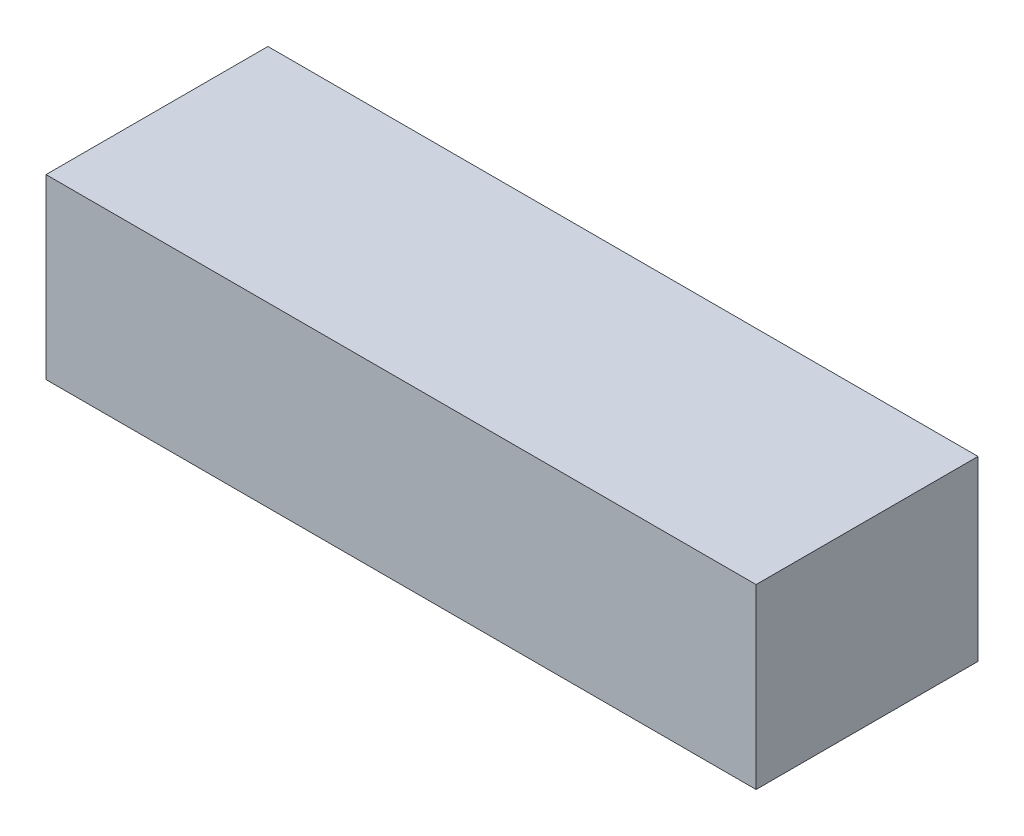
ISO-10303-21;
HEADER;
FILE_DESCRIPTION(('STEP AP214'),'2;1');
FILE_NAME('part.step','',(''),(''),'','','');
FILE_SCHEMA(('AUTOMOTIVE_DESIGN { 1 0 10303 214 1 1 1 1 }'));
ENDSEC;
DATA;
#1=APPLICATION_CONTEXT('core data for automotive mechanical design processes');
#2=APPLICATION_PROTOCOL_DEFINITION('international standard','automotive_design',2000,#1);
#3=PRODUCT_CONTEXT('',#1,'mechanical');
#4=PRODUCT('Part','Part','',(#3));
#5=PRODUCT_RELATED_PRODUCT_CATEGORY('part','',(#4));
#6=PRODUCT_DEFINITION_FORMATION('','',#4);
#7=PRODUCT_DEFINITION_CONTEXT('part definition',#1,'design');
#8=PRODUCT_DEFINITION('design','',#6,#7);
#9=PRODUCT_DEFINITION_SHAPE('','',#8);
#10=(LENGTH_UNIT() NAMED_UNIT(*) SI_UNIT(.MILLI.,.METRE.));
#11=(NAMED_UNIT(*) PLANE_ANGLE_UNIT() SI_UNIT($,.RADIAN.));
#12=(NAMED_UNIT(*) SI_UNIT($,.STERADIAN.) SOLID_ANGLE_UNIT());
#13=UNCERTAINTY_MEASURE_WITH_UNIT(LENGTH_MEASURE(1.E-05),#10,'distance_accuracy_value','');
#14=(GEOMETRIC_REPRESENTATION_CONTEXT(3) GLOBAL_UNCERTAINTY_ASSIGNED_CONTEXT((#13)) GLOBAL_UNIT_ASSIGNED_CONTEXT((#10,
#11,#12)) REPRESENTATION_CONTEXT('',''));
#15=CARTESIAN_POINT('',(0.,0.,0.));
#16=DIRECTION('',(0.,0.,1.));
#17=DIRECTION('',(1.,0.,0.));
#18=AXIS2_PLACEMENT_3D('',#15,#16,#17);
#19=CARTESIAN_POINT('',(0.,0.,31.75));
#20=DIRECTION('',(1.,0.,0.));
#21=DIRECTION('',(0.,1.,0.));
#22=AXIS2_PLACEMENT_3D('',#19,#20,#21);
#23=PLANE('',#22);
#24=DIRECTION('',(0.,-1.,0.));
#25=VECTOR('',#24,1.);
#26=CARTESIAN_POINT('',(0.,0.,0.));
#27=LINE('',#26,#25);
#28=CARTESIAN_POINT('',(0.,0.,0.));
#29=VERTEX_POINT('',#28);
#30=CARTESIAN_POINT('',(0.,-25.4,0.));
#31=VERTEX_POINT('',#30);
#32=EDGE_CURVE('E99',#29,#31,#27,.T.);
#33=ORIENTED_EDGE('',*,*,#32,.T.);
#34=DIRECTION('',(0.,0.,-1.));
#35=VECTOR('',#34,1.);
#36=CARTESIAN_POINT('',(0.,-25.4,31.75));
#37=LINE('',#36,#35);
#38=CARTESIAN_POINT('',(0.,-25.4,31.75));
#39=VERTEX_POINT('',#38);
#40=EDGE_CURVE('E11',#39,#31,#37,.T.);
#41=ORIENTED_EDGE('',*,*,#40,.F.);
#42=DIRECTION('',(0.,-1.,0.));
#43=VECTOR('',#42,1.);
#44=CARTESIAN_POINT('',(0.,0.,31.75));
#45=LINE('',#44,#43);
#46=CARTESIAN_POINT('',(0.,0.,31.75));
#47=VERTEX_POINT('',#46);
#48=EDGE_CURVE('E87',#47,#39,#45,.T.);
#49=ORIENTED_EDGE('',*,*,#48,.F.);
#50=DIRECTION('',(0.,0.,-1.));
#51=VECTOR('',#50,1.);
#52=CARTESIAN_POINT('',(0.,0.,31.75));
#53=LINE('',#52,#51);
#54=EDGE_CURVE('E95',#47,#29,#53,.T.);
#55=ORIENTED_EDGE('',*,*,#54,.T.);
#56=EDGE_LOOP('',(#33,#41,#49,#55));
#57=FACE_BOUND('',#56,.T.);
#58=ADVANCED_FACE('F36',(#57),#23,.F.);
#59=CARTESIAN_POINT('',(0.,-25.4,31.75));
#60=DIRECTION('',(0.,1.,0.));
#61=DIRECTION('',(0.,0.,1.));
#62=AXIS2_PLACEMENT_3D('',#59,#60,#61);
#63=PLANE('',#62);
#64=DIRECTION('',(1.,0.,0.));
#65=VECTOR('',#64,1.);
#66=CARTESIAN_POINT('',(0.,-25.4,0.));
#67=LINE('',#66,#65);
#68=CARTESIAN_POINT('',(101.6,-25.4,0.));
#69=VERTEX_POINT('',#68);
#70=EDGE_CURVE('E91',#31,#69,#67,.T.);
#71=ORIENTED_EDGE('',*,*,#70,.T.);
#72=DIRECTION('',(0.,0.,-1.));
#73=VECTOR('',#72,1.);
#74=CARTESIAN_POINT('',(101.6,-25.4,31.75));
#75=LINE('',#74,#73);
#76=CARTESIAN_POINT('',(101.6,-25.4,31.75));
#77=VERTEX_POINT('',#76);
#78=EDGE_CURVE('E44',#77,#69,#75,.T.);
#79=ORIENTED_EDGE('',*,*,#78,.F.);
#80=DIRECTION('',(1.,0.,0.));
#81=VECTOR('',#80,1.);
#82=CARTESIAN_POINT('',(0.,-25.4,31.75));
#83=LINE('',#82,#81);
#84=EDGE_CURVE('E82',#39,#77,#83,.T.);
#85=ORIENTED_EDGE('',*,*,#84,.F.);
#86=ORIENTED_EDGE('',*,*,#40,.T.);
#87=EDGE_LOOP('',(#71,#79,#85,#86));
#88=FACE_BOUND('',#87,.T.);
#89=ADVANCED_FACE('F90',(#88),#63,.F.);
#90=CARTESIAN_POINT('',(101.6,0.,31.75));
#91=DIRECTION('',(-1.,0.,0.));
#92=DIRECTION('',(0.,0.,1.));
#93=AXIS2_PLACEMENT_3D('',#90,#91,#92);
#94=PLANE('',#93);
#95=DIRECTION('',(0.,1.,0.));
#96=VECTOR('',#95,1.);
#97=CARTESIAN_POINT('',(101.6,0.,0.));
#98=LINE('',#97,#96);
#99=CARTESIAN_POINT('',(101.6,0.,0.));
#100=VERTEX_POINT('',#99);
#101=EDGE_CURVE('E69',#69,#100,#98,.T.);
#102=ORIENTED_EDGE('',*,*,#101,.T.);
#103=DIRECTION('',(0.,0.,-1.));
#104=VECTOR('',#103,1.);
#105=CARTESIAN_POINT('',(101.6,0.,31.75));
#106=LINE('',#105,#104);
#107=CARTESIAN_POINT('',(101.6,0.,31.75));
#108=VERTEX_POINT('',#107);
#109=EDGE_CURVE('E92',#108,#100,#106,.T.);
#110=ORIENTED_EDGE('',*,*,#109,.F.);
#111=DIRECTION('',(0.,1.,0.));
#112=VECTOR('',#111,1.);
#113=CARTESIAN_POINT('',(101.6,0.,31.75));
#114=LINE('',#113,#112);
#115=EDGE_CURVE('E85',#77,#108,#114,.T.);
#116=ORIENTED_EDGE('',*,*,#115,.F.);
#117=ORIENTED_EDGE('',*,*,#78,.T.);
#118=EDGE_LOOP('',(#102,#110,#116,#117));
#119=FACE_BOUND('',#118,.T.);
#120=ADVANCED_FACE('F93',(#119),#94,.F.);
#121=CARTESIAN_POINT('',(0.,0.,31.75));
#122=DIRECTION('',(0.,-1.,0.));
#123=DIRECTION('',(0.,0.,-1.));
#124=AXIS2_PLACEMENT_3D('',#121,#122,#123);
#125=PLANE('',#124);
#126=DIRECTION('',(-1.,0.,0.));
#127=VECTOR('',#126,1.);
#128=CARTESIAN_POINT('',(0.,0.,0.));
#129=LINE('',#128,#127);
#130=EDGE_CURVE('E75',#100,#29,#129,.T.);
#131=ORIENTED_EDGE('',*,*,#130,.T.);
#132=ORIENTED_EDGE('',*,*,#54,.F.);
#133=DIRECTION('',(-1.,0.,0.));
#134=VECTOR('',#133,1.);
#135=CARTESIAN_POINT('',(0.,0.,31.75));
#136=LINE('',#135,#134);
#137=EDGE_CURVE('E52',#108,#47,#136,.T.);
#138=ORIENTED_EDGE('',*,*,#137,.F.);
#139=ORIENTED_EDGE('',*,*,#109,.T.);
#140=EDGE_LOOP('',(#131,#132,#138,#139));
#141=FACE_BOUND('',#140,.T.);
#142=ADVANCED_FACE('F106',(#141),#125,.F.);
#143=CARTESIAN_POINT('',(0.,0.,31.75));
#144=DIRECTION('',(0.,0.,1.));
#145=DIRECTION('',(1.,0.,0.));
#146=AXIS2_PLACEMENT_3D('',#143,#144,#145);
#147=PLANE('',#146);
#148=ORIENTED_EDGE('',*,*,#48,.T.);
#149=ORIENTED_EDGE('',*,*,#84,.T.);
#150=ORIENTED_EDGE('',*,*,#115,.T.);
#151=ORIENTED_EDGE('',*,*,#137,.T.);
#152=EDGE_LOOP('',(#148,#149,#150,#151));
#153=FACE_BOUND('',#152,.T.);
#154=ADVANCED_FACE('F83',(#153),#147,.T.);
#155=CARTESIAN_POINT('',(0.,0.,0.));
#156=DIRECTION('',(0.,0.,1.));
#157=DIRECTION('',(1.,0.,0.));
#158=AXIS2_PLACEMENT_3D('',#155,#156,#157);
#159=PLANE('',#158);
#160=ORIENTED_EDGE('',*,*,#32,.F.);
#161=ORIENTED_EDGE('',*,*,#130,.F.);
#162=ORIENTED_EDGE('',*,*,#101,.F.);
#163=ORIENTED_EDGE('',*,*,#70,.F.);
#164=EDGE_LOOP('',(#160,#161,#162,#163));
#165=FACE_BOUND('',#164,.T.);
#166=ADVANCED_FACE('F109',(#165),#159,.F.);
#167=CLOSED_SHELL('',(#58,#89,#120,#142,#154,#166));
#168=MANIFOLD_SOLID_BREP('B2',#167);
#169=ADVANCED_BREP_SHAPE_REPRESENTATION('',(#18,#168),#14);
#170=SHAPE_DEFINITION_REPRESENTATION(#9,#169);
ENDSEC;
END-ISO-10303-21;
